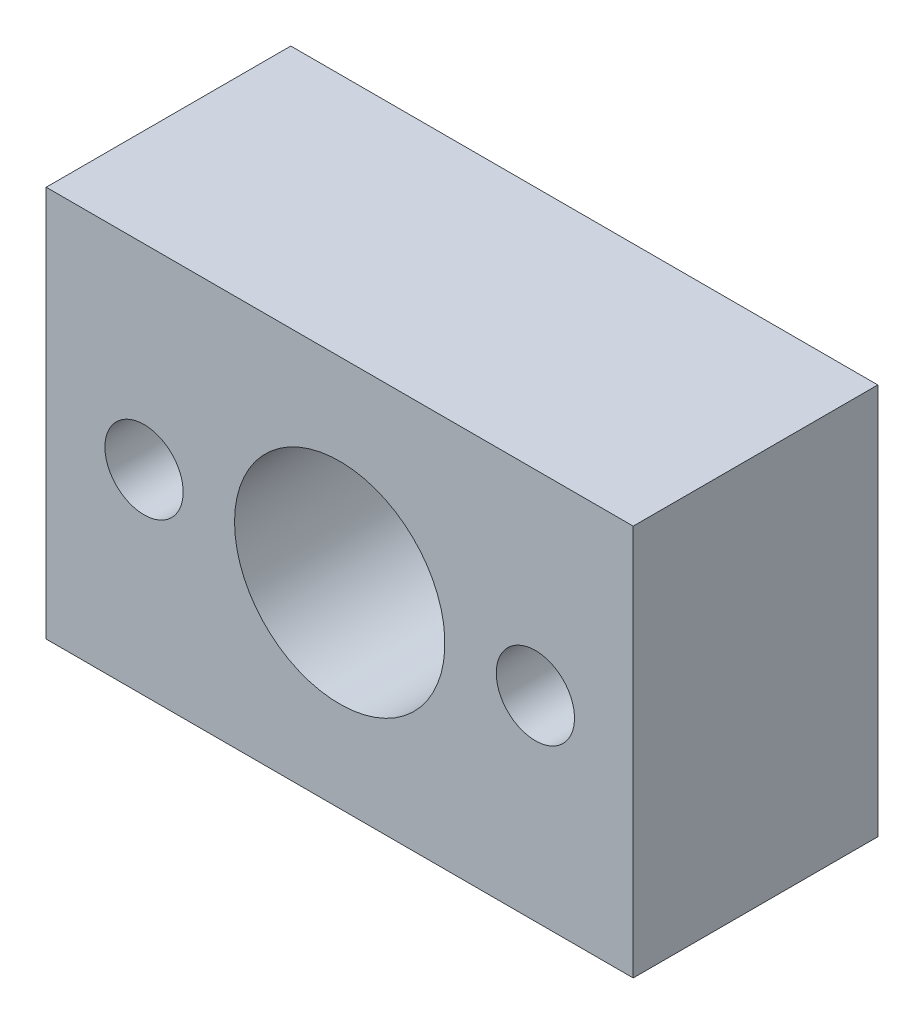
ISO-10303-21;
HEADER;
FILE_DESCRIPTION(('STEP AP214'),'2;1');
FILE_NAME('part.step','',(''),(''),'','','');
FILE_SCHEMA(('AUTOMOTIVE_DESIGN { 1 0 10303 214 1 1 1 1 }'));
ENDSEC;
DATA;
#1=APPLICATION_CONTEXT('core data for automotive mechanical design processes');
#2=APPLICATION_PROTOCOL_DEFINITION('international standard','automotive_design',2000,#1);
#3=PRODUCT_CONTEXT('',#1,'mechanical');
#4=PRODUCT('Part','Part','',(#3));
#5=PRODUCT_RELATED_PRODUCT_CATEGORY('part','',(#4));
#6=PRODUCT_DEFINITION_FORMATION('','',#4);
#7=PRODUCT_DEFINITION_CONTEXT('part definition',#1,'design');
#8=PRODUCT_DEFINITION('design','',#6,#7);
#9=PRODUCT_DEFINITION_SHAPE('','',#8);
#10=(LENGTH_UNIT() NAMED_UNIT(*) SI_UNIT(.MILLI.,.METRE.));
#11=(NAMED_UNIT(*) PLANE_ANGLE_UNIT() SI_UNIT($,.RADIAN.));
#12=(NAMED_UNIT(*) SI_UNIT($,.STERADIAN.) SOLID_ANGLE_UNIT());
#13=UNCERTAINTY_MEASURE_WITH_UNIT(LENGTH_MEASURE(1.E-05),#10,'distance_accuracy_value','');
#14=(GEOMETRIC_REPRESENTATION_CONTEXT(3) GLOBAL_UNCERTAINTY_ASSIGNED_CONTEXT((#13)) GLOBAL_UNIT_ASSIGNED_CONTEXT((#10,
#11,#12)) REPRESENTATION_CONTEXT('',''));
#15=CARTESIAN_POINT('',(0.,0.,0.));
#16=DIRECTION('',(0.,0.,1.));
#17=DIRECTION('',(1.,0.,0.));
#18=AXIS2_PLACEMENT_3D('',#15,#16,#17);
#19=CARTESIAN_POINT('',(-12.,-8.,10.));
#20=DIRECTION('',(1.,0.,0.));
#21=DIRECTION('',(0.,0.,-1.));
#22=AXIS2_PLACEMENT_3D('',#19,#20,#21);
#23=PLANE('',#22);
#24=DIRECTION('',(0.,-1.,0.));
#25=VECTOR('',#24,1.);
#26=CARTESIAN_POINT('',(-12.,-8.,0.));
#27=LINE('',#26,#25);
#28=CARTESIAN_POINT('',(-12.,8.,0.));
#29=VERTEX_POINT('',#28);
#30=CARTESIAN_POINT('',(-12.,-8.,0.));
#31=VERTEX_POINT('',#30);
#32=EDGE_CURVE('E114',#29,#31,#27,.T.);
#33=ORIENTED_EDGE('',*,*,#32,.T.);
#34=DIRECTION('',(0.,0.,-1.));
#35=VECTOR('',#34,1.);
#36=CARTESIAN_POINT('',(-12.,-8.,10.));
#37=LINE('',#36,#35);
#38=CARTESIAN_POINT('',(-12.,-8.,10.));
#39=VERTEX_POINT('',#38);
#40=EDGE_CURVE('E11',#39,#31,#37,.T.);
#41=ORIENTED_EDGE('',*,*,#40,.F.);
#42=DIRECTION('',(0.,-1.,0.));
#43=VECTOR('',#42,1.);
#44=CARTESIAN_POINT('',(-12.,-8.,10.));
#45=LINE('',#44,#43);
#46=CARTESIAN_POINT('',(-12.,8.,10.));
#47=VERTEX_POINT('',#46);
#48=EDGE_CURVE('E100',#47,#39,#45,.T.);
#49=ORIENTED_EDGE('',*,*,#48,.F.);
#50=DIRECTION('',(0.,0.,-1.));
#51=VECTOR('',#50,1.);
#52=CARTESIAN_POINT('',(-12.,8.,10.));
#53=LINE('',#52,#51);
#54=EDGE_CURVE('E108',#47,#29,#53,.T.);
#55=ORIENTED_EDGE('',*,*,#54,.T.);
#56=EDGE_LOOP('',(#33,#41,#49,#55));
#57=FACE_BOUND('',#56,.T.);
#58=ADVANCED_FACE('F44',(#57),#23,.F.);
#59=CARTESIAN_POINT('',(-12.,-8.,10.));
#60=DIRECTION('',(0.,1.,0.));
#61=DIRECTION('',(0.,0.,1.));
#62=AXIS2_PLACEMENT_3D('',#59,#60,#61);
#63=PLANE('',#62);
#64=DIRECTION('',(1.,0.,0.));
#65=VECTOR('',#64,1.);
#66=CARTESIAN_POINT('',(-12.,-8.,0.));
#67=LINE('',#66,#65);
#68=CARTESIAN_POINT('',(12.,-8.,0.));
#69=VERTEX_POINT('',#68);
#70=EDGE_CURVE('E105',#31,#69,#67,.T.);
#71=ORIENTED_EDGE('',*,*,#70,.T.);
#72=DIRECTION('',(0.,0.,-1.));
#73=VECTOR('',#72,1.);
#74=CARTESIAN_POINT('',(12.,-8.,10.));
#75=LINE('',#74,#73);
#76=CARTESIAN_POINT('',(12.,-8.,10.));
#77=VERTEX_POINT('',#76);
#78=EDGE_CURVE('E53',#77,#69,#75,.T.);
#79=ORIENTED_EDGE('',*,*,#78,.F.);
#80=DIRECTION('',(1.,0.,0.));
#81=VECTOR('',#80,1.);
#82=CARTESIAN_POINT('',(-12.,-8.,10.));
#83=LINE('',#82,#81);
#84=EDGE_CURVE('E95',#39,#77,#83,.T.);
#85=ORIENTED_EDGE('',*,*,#84,.F.);
#86=ORIENTED_EDGE('',*,*,#40,.T.);
#87=EDGE_LOOP('',(#71,#79,#85,#86));
#88=FACE_BOUND('',#87,.T.);
#89=ADVANCED_FACE('F101',(#88),#63,.F.);
#90=CARTESIAN_POINT('',(12.,-8.,10.));
#91=DIRECTION('',(-1.,0.,0.));
#92=DIRECTION('',(0.,0.,1.));
#93=AXIS2_PLACEMENT_3D('',#90,#91,#92);
#94=PLANE('',#93);
#95=DIRECTION('',(0.,1.,0.));
#96=VECTOR('',#95,1.);
#97=CARTESIAN_POINT('',(12.,-8.,0.));
#98=LINE('',#97,#96);
#99=CARTESIAN_POINT('',(12.,8.,0.));
#100=VERTEX_POINT('',#99);
#101=EDGE_CURVE('E76',#69,#100,#98,.T.);
#102=ORIENTED_EDGE('',*,*,#101,.T.);
#103=DIRECTION('',(0.,0.,-1.));
#104=VECTOR('',#103,1.);
#105=CARTESIAN_POINT('',(12.,8.,10.));
#106=LINE('',#105,#104);
#107=CARTESIAN_POINT('',(12.,8.,10.));
#108=VERTEX_POINT('',#107);
#109=EDGE_CURVE('E102',#108,#100,#106,.T.);
#110=ORIENTED_EDGE('',*,*,#109,.F.);
#111=DIRECTION('',(0.,1.,0.));
#112=VECTOR('',#111,1.);
#113=CARTESIAN_POINT('',(12.,-8.,10.));
#114=LINE('',#113,#112);
#115=EDGE_CURVE('E92',#77,#108,#114,.T.);
#116=ORIENTED_EDGE('',*,*,#115,.F.);
#117=ORIENTED_EDGE('',*,*,#78,.T.);
#118=EDGE_LOOP('',(#102,#110,#116,#117));
#119=FACE_BOUND('',#118,.T.);
#120=ADVANCED_FACE('F104',(#119),#94,.F.);
#121=CARTESIAN_POINT('',(-12.,8.,10.));
#122=DIRECTION('',(0.,-1.,0.));
#123=DIRECTION('',(0.,0.,-1.));
#124=AXIS2_PLACEMENT_3D('',#121,#122,#123);
#125=PLANE('',#124);
#126=DIRECTION('',(-1.,0.,0.));
#127=VECTOR('',#126,1.);
#128=CARTESIAN_POINT('',(-12.,8.,0.));
#129=LINE('',#128,#127);
#130=EDGE_CURVE('E82',#100,#29,#129,.T.);
#131=ORIENTED_EDGE('',*,*,#130,.T.);
#132=ORIENTED_EDGE('',*,*,#54,.F.);
#133=DIRECTION('',(-1.,0.,0.));
#134=VECTOR('',#133,1.);
#135=CARTESIAN_POINT('',(-12.,8.,10.));
#136=LINE('',#135,#134);
#137=EDGE_CURVE('E65',#108,#47,#136,.T.);
#138=ORIENTED_EDGE('',*,*,#137,.F.);
#139=ORIENTED_EDGE('',*,*,#109,.T.);
#140=EDGE_LOOP('',(#131,#132,#138,#139));
#141=FACE_BOUND('',#140,.T.);
#142=ADVANCED_FACE('F130',(#141),#125,.F.);
#143=CARTESIAN_POINT('',(0.,0.,10.));
#144=DIRECTION('',(0.,0.,-1.));
#145=DIRECTION('',(-1.,0.,0.));
#146=AXIS2_PLACEMENT_3D('',#143,#144,#145);
#147=PLANE('',#146);
#148=CARTESIAN_POINT('',(-8.,0.,10.));
#149=DIRECTION('',(0.,0.,-1.));
#150=DIRECTION('',(-1.,0.,0.));
#151=AXIS2_PLACEMENT_3D('',#148,#149,#150);
#152=CIRCLE('',#151,1.6);
#153=CARTESIAN_POINT('',(-9.6,0.,10.));
#154=VERTEX_POINT('',#153);
#155=EDGE_CURVE('E120',#154,#154,#152,.F.);
#156=ORIENTED_EDGE('',*,*,#155,.F.);
#157=EDGE_LOOP('',(#156));
#158=FACE_BOUND('',#157,.T.);
#159=CARTESIAN_POINT('',(8.,0.,10.));
#160=DIRECTION('',(0.,0.,-1.));
#161=DIRECTION('',(-1.,0.,0.));
#162=AXIS2_PLACEMENT_3D('',#159,#160,#161);
#163=CIRCLE('',#162,1.6);
#164=CARTESIAN_POINT('',(6.4,0.,10.));
#165=VERTEX_POINT('',#164);
#166=EDGE_CURVE('E136',#165,#165,#163,.F.);
#167=ORIENTED_EDGE('',*,*,#166,.F.);
#168=EDGE_LOOP('',(#167));
#169=FACE_BOUND('',#168,.T.);
#170=CARTESIAN_POINT('',(0.,0.,10.));
#171=DIRECTION('',(0.,0.,-1.));
#172=DIRECTION('',(-1.,0.,0.));
#173=AXIS2_PLACEMENT_3D('',#170,#171,#172);
#174=CIRCLE('',#173,4.3);
#175=CARTESIAN_POINT('',(-4.3,0.,10.));
#176=VERTEX_POINT('',#175);
#177=EDGE_CURVE('E143',#176,#176,#174,.F.);
#178=ORIENTED_EDGE('',*,*,#177,.F.);
#179=EDGE_LOOP('',(#178));
#180=FACE_BOUND('',#179,.T.);
#181=ORIENTED_EDGE('',*,*,#48,.T.);
#182=ORIENTED_EDGE('',*,*,#84,.T.);
#183=ORIENTED_EDGE('',*,*,#115,.T.);
#184=ORIENTED_EDGE('',*,*,#137,.T.);
#185=EDGE_LOOP('',(#181,#182,#183,#184));
#186=FACE_BOUND('',#185,.T.);
#187=ADVANCED_FACE('F91',(#158,#169,#180,#186),#147,.F.);
#188=CARTESIAN_POINT('',(0.,0.,0.));
#189=DIRECTION('',(0.,0.,-1.));
#190=DIRECTION('',(-1.,0.,0.));
#191=AXIS2_PLACEMENT_3D('',#188,#189,#190);
#192=PLANE('',#191);
#193=CARTESIAN_POINT('',(-8.,0.,0.));
#194=DIRECTION('',(0.,0.,1.));
#195=DIRECTION('',(1.,0.,0.));
#196=AXIS2_PLACEMENT_3D('',#193,#194,#195);
#197=CIRCLE('',#196,1.6);
#198=CARTESIAN_POINT('',(-6.4,0.,0.));
#199=VERTEX_POINT('',#198);
#200=EDGE_CURVE('E147',#199,#199,#197,.T.);
#201=ORIENTED_EDGE('',*,*,#200,.T.);
#202=EDGE_LOOP('',(#201));
#203=FACE_BOUND('',#202,.T.);
#204=CARTESIAN_POINT('',(8.,0.,0.));
#205=DIRECTION('',(0.,0.,1.));
#206=DIRECTION('',(1.,0.,0.));
#207=AXIS2_PLACEMENT_3D('',#204,#205,#206);
#208=CIRCLE('',#207,1.6);
#209=CARTESIAN_POINT('',(9.6,0.,0.));
#210=VERTEX_POINT('',#209);
#211=EDGE_CURVE('E149',#210,#210,#208,.T.);
#212=ORIENTED_EDGE('',*,*,#211,.T.);
#213=EDGE_LOOP('',(#212));
#214=FACE_BOUND('',#213,.T.);
#215=CARTESIAN_POINT('',(0.,0.,0.));
#216=DIRECTION('',(0.,0.,1.));
#217=DIRECTION('',(1.,0.,0.));
#218=AXIS2_PLACEMENT_3D('',#215,#216,#217);
#219=CIRCLE('',#218,4.3);
#220=CARTESIAN_POINT('',(4.3,0.,0.));
#221=VERTEX_POINT('',#220);
#222=EDGE_CURVE('E144',#221,#221,#219,.T.);
#223=ORIENTED_EDGE('',*,*,#222,.T.);
#224=EDGE_LOOP('',(#223));
#225=FACE_BOUND('',#224,.T.);
#226=ORIENTED_EDGE('',*,*,#32,.F.);
#227=ORIENTED_EDGE('',*,*,#130,.F.);
#228=ORIENTED_EDGE('',*,*,#101,.F.);
#229=ORIENTED_EDGE('',*,*,#70,.F.);
#230=EDGE_LOOP('',(#226,#227,#228,#229));
#231=FACE_BOUND('',#230,.T.);
#232=ADVANCED_FACE('F128',(#203,#214,#225,#231),#192,.T.);
#233=CARTESIAN_POINT('',(0.,0.,11.));
#234=DIRECTION('',(0.,0.,-1.));
#235=DIRECTION('',(-1.,0.,0.));
#236=AXIS2_PLACEMENT_3D('',#233,#234,#235);
#237=CYLINDRICAL_SURFACE('',#236,4.3);
#238=ORIENTED_EDGE('',*,*,#222,.F.);
#239=EDGE_LOOP('',(#238));
#240=FACE_BOUND('',#239,.T.);
#241=ORIENTED_EDGE('',*,*,#177,.T.);
#242=EDGE_LOOP('',(#241));
#243=FACE_BOUND('',#242,.T.);
#244=ADVANCED_FACE('F163',(#240,#243),#237,.F.);
#245=CARTESIAN_POINT('',(8.,0.,11.));
#246=DIRECTION('',(0.,0.,-1.));
#247=DIRECTION('',(-1.,0.,0.));
#248=AXIS2_PLACEMENT_3D('',#245,#246,#247);
#249=CYLINDRICAL_SURFACE('',#248,1.6);
#250=ORIENTED_EDGE('',*,*,#211,.F.);
#251=EDGE_LOOP('',(#250));
#252=FACE_BOUND('',#251,.T.);
#253=ORIENTED_EDGE('',*,*,#166,.T.);
#254=EDGE_LOOP('',(#253));
#255=FACE_BOUND('',#254,.T.);
#256=ADVANCED_FACE('F159',(#252,#255),#249,.F.);
#257=CARTESIAN_POINT('',(-8.,0.,11.));
#258=DIRECTION('',(0.,0.,-1.));
#259=DIRECTION('',(-1.,0.,0.));
#260=AXIS2_PLACEMENT_3D('',#257,#258,#259);
#261=CYLINDRICAL_SURFACE('',#260,1.6);
#262=ORIENTED_EDGE('',*,*,#200,.F.);
#263=EDGE_LOOP('',(#262));
#264=FACE_BOUND('',#263,.T.);
#265=ORIENTED_EDGE('',*,*,#155,.T.);
#266=EDGE_LOOP('',(#265));
#267=FACE_BOUND('',#266,.T.);
#268=ADVANCED_FACE('F162',(#264,#267),#261,.F.);
#269=CLOSED_SHELL('',(#58,#89,#120,#142,#187,#232,#244,#256,#268));
#270=MANIFOLD_SOLID_BREP('B2',#269);
#271=ADVANCED_BREP_SHAPE_REPRESENTATION('',(#18,#270),#14);
#272=SHAPE_DEFINITION_REPRESENTATION(#9,#271);
ENDSEC;
END-ISO-10303-21;
